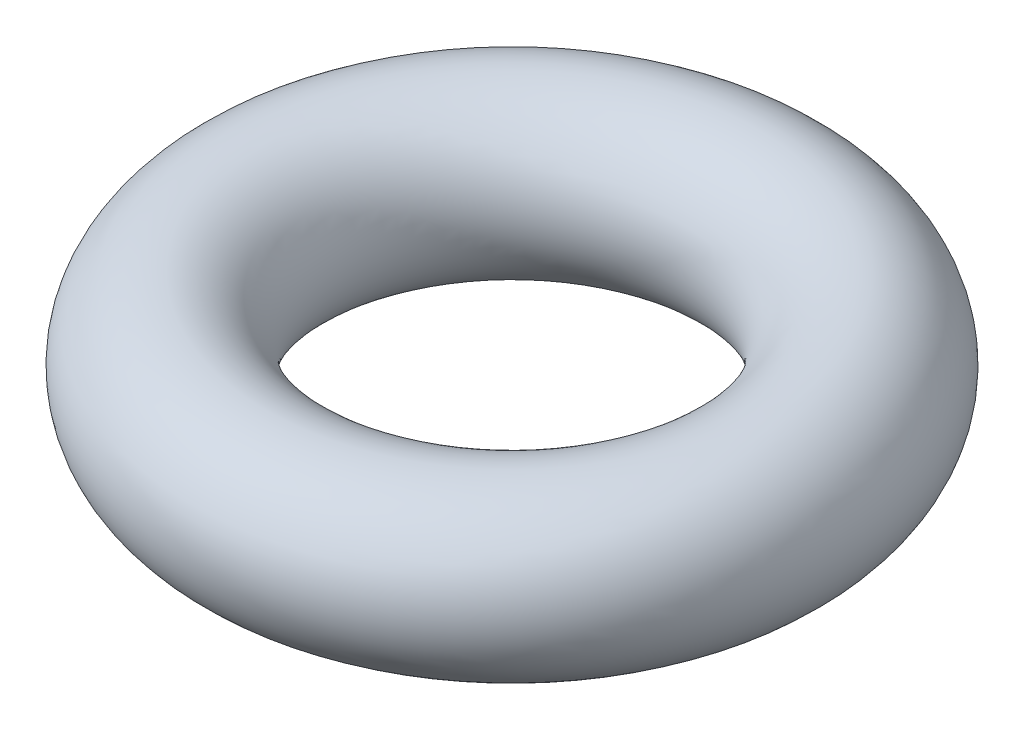
ISO-10303-21;
HEADER;
FILE_DESCRIPTION(('STEP AP214'),'2;1');
FILE_NAME('part.step','',(''),(''),'','','');
FILE_SCHEMA(('AUTOMOTIVE_DESIGN { 1 0 10303 214 1 1 1 1 }'));
ENDSEC;
DATA;
#1=APPLICATION_CONTEXT('core data for automotive mechanical design processes');
#2=APPLICATION_PROTOCOL_DEFINITION('international standard','automotive_design',2000,#1);
#3=PRODUCT_CONTEXT('',#1,'mechanical');
#4=PRODUCT('Part','Part','',(#3));
#5=PRODUCT_RELATED_PRODUCT_CATEGORY('part','',(#4));
#6=PRODUCT_DEFINITION_FORMATION('','',#4);
#7=PRODUCT_DEFINITION_CONTEXT('part definition',#1,'design');
#8=PRODUCT_DEFINITION('design','',#6,#7);
#9=PRODUCT_DEFINITION_SHAPE('','',#8);
#10=(LENGTH_UNIT() NAMED_UNIT(*) SI_UNIT(.MILLI.,.METRE.));
#11=(NAMED_UNIT(*) PLANE_ANGLE_UNIT() SI_UNIT($,.RADIAN.));
#12=(NAMED_UNIT(*) SI_UNIT($,.STERADIAN.) SOLID_ANGLE_UNIT());
#13=UNCERTAINTY_MEASURE_WITH_UNIT(LENGTH_MEASURE(1.E-05),#10,'distance_accuracy_value','');
#14=(GEOMETRIC_REPRESENTATION_CONTEXT(3) GLOBAL_UNCERTAINTY_ASSIGNED_CONTEXT((#13)) GLOBAL_UNIT_ASSIGNED_CONTEXT((#10,
#11,#12)) REPRESENTATION_CONTEXT('',''));
#15=CARTESIAN_POINT('',(0.,0.,0.));
#16=DIRECTION('',(0.,0.,1.));
#17=DIRECTION('',(1.,0.,0.));
#18=AXIS2_PLACEMENT_3D('',#15,#16,#17);
#19=CARTESIAN_POINT('',(0.,0.,0.));
#20=DIRECTION('',(0.,1.,0.));
#21=DIRECTION('',(-1.,0.,0.));
#22=AXIS2_PLACEMENT_3D('',#19,#20,#21);
#23=TOROIDAL_SURFACE('',#22,1.5,0.500000000000001);
#24=CARTESIAN_POINT('',(-2.,0.,0.));
#25=VERTEX_POINT('',#24);
#26=VERTEX_LOOP('',#25);
#27=FACE_BOUND('',#26,.T.);
#28=ADVANCED_FACE('F28',(#27),#23,.T.);
#29=CLOSED_SHELL('',(#28));
#30=MANIFOLD_SOLID_BREP('B2',#29);
#31=ADVANCED_BREP_SHAPE_REPRESENTATION('',(#18,#30),#14);
#32=SHAPE_DEFINITION_REPRESENTATION(#9,#31);
ENDSEC;
END-ISO-10303-21;
